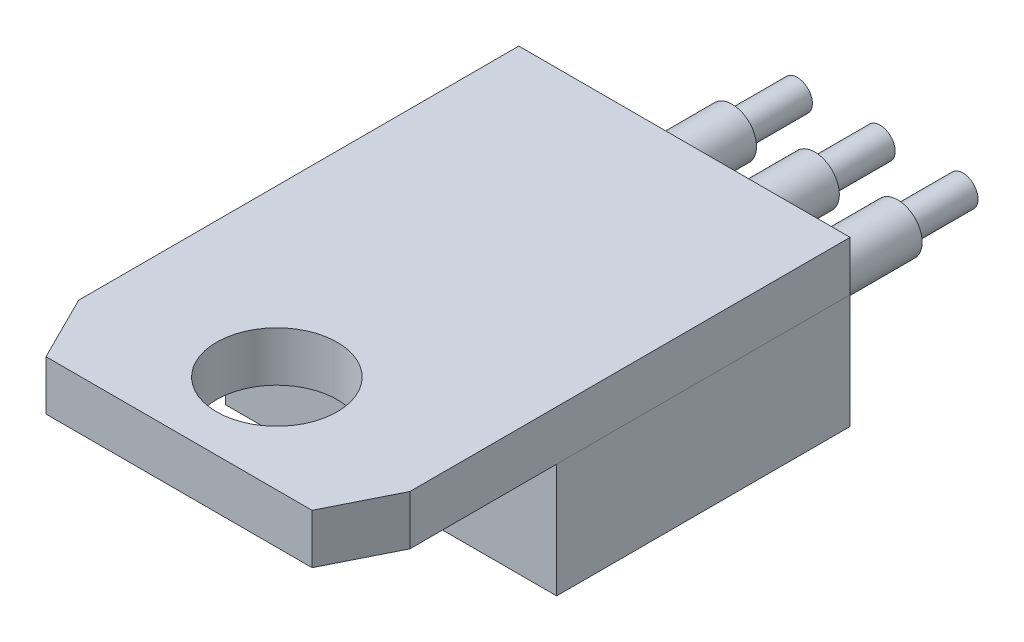
ISO-10303-21;
HEADER;
FILE_DESCRIPTION(('STEP AP214'),'2;1');
FILE_NAME('part.step','',(''),(''),'','','');
FILE_SCHEMA(('AUTOMOTIVE_DESIGN { 1 0 10303 214 1 1 1 1 }'));
ENDSEC;
DATA;
#1=APPLICATION_CONTEXT('core data for automotive mechanical design processes');
#2=APPLICATION_PROTOCOL_DEFINITION('international standard','automotive_design',2000,#1);
#3=PRODUCT_CONTEXT('',#1,'mechanical');
#4=PRODUCT('Part','Part','',(#3));
#5=PRODUCT_RELATED_PRODUCT_CATEGORY('part','',(#4));
#6=PRODUCT_DEFINITION_FORMATION('','',#4);
#7=PRODUCT_DEFINITION_CONTEXT('part definition',#1,'design');
#8=PRODUCT_DEFINITION('design','',#6,#7);
#9=PRODUCT_DEFINITION_SHAPE('','',#8);
#10=(LENGTH_UNIT() NAMED_UNIT(*) SI_UNIT(.MILLI.,.METRE.));
#11=(NAMED_UNIT(*) PLANE_ANGLE_UNIT() SI_UNIT($,.RADIAN.));
#12=(NAMED_UNIT(*) SI_UNIT($,.STERADIAN.) SOLID_ANGLE_UNIT());
#13=UNCERTAINTY_MEASURE_WITH_UNIT(LENGTH_MEASURE(1.E-05),#10,'distance_accuracy_value','');
#14=(GEOMETRIC_REPRESENTATION_CONTEXT(3) GLOBAL_UNCERTAINTY_ASSIGNED_CONTEXT((#13)) GLOBAL_UNIT_ASSIGNED_CONTEXT((#10,
#11,#12)) REPRESENTATION_CONTEXT('',''));
#15=CARTESIAN_POINT('',(0.,0.,0.));
#16=DIRECTION('',(0.,0.,1.));
#17=DIRECTION('',(1.,0.,0.));
#18=AXIS2_PLACEMENT_3D('',#15,#16,#17);
#19=CARTESIAN_POINT('',(5.0800000000002,167.114407598193,0.));
#20=DIRECTION('',(1.,0.,0.));
#21=DIRECTION('',(0.,0.,-1.));
#22=AXIS2_PLACEMENT_3D('',#19,#20,#21);
#23=PLANE('',#22);
#24=DIRECTION('',(0.,0.,1.));
#25=VECTOR('',#24,1.);
#26=CARTESIAN_POINT('',(5.0800000000002,165.590407598193,0.));
#27=LINE('',#26,#25);
#28=CARTESIAN_POINT('',(5.0800000000002,165.590407598193,9.));
#29=VERTEX_POINT('',#28);
#30=CARTESIAN_POINT('',(5.0800000000002,165.590407598193,13.5000000000001));
#31=VERTEX_POINT('',#30);
#32=EDGE_CURVE('E176',#29,#31,#27,.T.);
#33=ORIENTED_EDGE('',*,*,#32,.F.);
#34=DIRECTION('',(0.,0.,-1.));
#35=VECTOR('',#34,1.);
#36=CARTESIAN_POINT('',(5.0800000000002,165.590407598193,0.));
#37=LINE('',#36,#35);
#38=CARTESIAN_POINT('',(5.0800000000002,165.590407598193,0.));
#39=VERTEX_POINT('',#38);
#40=EDGE_CURVE('E11',#29,#39,#37,.T.);
#41=ORIENTED_EDGE('',*,*,#40,.T.);
#42=DIRECTION('',(0.,-1.,0.));
#43=VECTOR('',#42,1.);
#44=CARTESIAN_POINT('',(5.0800000000002,167.114407598193,0.));
#45=LINE('',#44,#43);
#46=CARTESIAN_POINT('',(5.0800000000002,167.114407598193,0.));
#47=VERTEX_POINT('',#46);
#48=EDGE_CURVE('E203',#47,#39,#45,.T.);
#49=ORIENTED_EDGE('',*,*,#48,.F.);
#50=DIRECTION('',(0.,0.,1.));
#51=VECTOR('',#50,1.);
#52=CARTESIAN_POINT('',(5.0800000000002,167.114407598193,0.));
#53=LINE('',#52,#51);
#54=CARTESIAN_POINT('',(5.0800000000002,167.114407598193,13.5000000000001));
#55=VERTEX_POINT('',#54);
#56=EDGE_CURVE('E214',#47,#55,#53,.T.);
#57=ORIENTED_EDGE('',*,*,#56,.T.);
#58=DIRECTION('',(0.,-1.,0.));
#59=VECTOR('',#58,1.);
#60=CARTESIAN_POINT('',(5.0800000000002,167.114407598193,13.5000000000001));
#61=LINE('',#60,#59);
#62=EDGE_CURVE('E200',#55,#31,#61,.T.);
#63=ORIENTED_EDGE('',*,*,#62,.T.);
#64=EDGE_LOOP('',(#33,#41,#49,#57,#63));
#65=FACE_BOUND('',#64,.T.);
#66=ADVANCED_FACE('F37',(#65),#23,.T.);
#67=CARTESIAN_POINT('',(-5.08000000000019,167.114407598193,0.));
#68=DIRECTION('',(0.,0.,-1.));
#69=DIRECTION('',(-1.,0.,0.));
#70=AXIS2_PLACEMENT_3D('',#67,#68,#69);
#71=PLANE('',#70);
#72=ORIENTED_EDGE('',*,*,#48,.T.);
#73=DIRECTION('',(-1.,0.,0.));
#74=VECTOR('',#73,1.);
#75=CARTESIAN_POINT('',(-5.08000000000019,165.590407598193,0.));
#76=LINE('',#75,#74);
#77=CARTESIAN_POINT('',(-5.08000000000019,165.590407598193,0.));
#78=VERTEX_POINT('',#77);
#79=EDGE_CURVE('E47',#39,#78,#76,.T.);
#80=ORIENTED_EDGE('',*,*,#79,.T.);
#81=DIRECTION('',(0.,-1.,0.));
#82=VECTOR('',#81,1.);
#83=CARTESIAN_POINT('',(-5.08000000000019,167.114407598193,0.));
#84=LINE('',#83,#82);
#85=CARTESIAN_POINT('',(-5.08000000000019,167.114407598193,0.));
#86=VERTEX_POINT('',#85);
#87=EDGE_CURVE('E167',#86,#78,#84,.T.);
#88=ORIENTED_EDGE('',*,*,#87,.F.);
#89=DIRECTION('',(1.,0.,0.));
#90=VECTOR('',#89,1.);
#91=CARTESIAN_POINT('',(-5.08000000000019,167.114407598193,0.));
#92=LINE('',#91,#90);
#93=EDGE_CURVE('E219',#86,#47,#92,.T.);
#94=ORIENTED_EDGE('',*,*,#93,.T.);
#95=EDGE_LOOP('',(#72,#80,#88,#94));
#96=FACE_BOUND('',#95,.T.);
#97=ADVANCED_FACE('F244',(#96),#71,.T.);
#98=CARTESIAN_POINT('',(-5.0800000000002,167.114407598193,13.5000000000001));
#99=DIRECTION('',(-1.,0.,0.));
#100=DIRECTION('',(0.,0.,1.));
#101=AXIS2_PLACEMENT_3D('',#98,#99,#100);
#102=PLANE('',#101);
#103=ORIENTED_EDGE('',*,*,#87,.T.);
#104=DIRECTION('',(0.,0.,1.));
#105=VECTOR('',#104,1.);
#106=CARTESIAN_POINT('',(-5.0800000000002,165.590407598193,13.5000000000001));
#107=LINE('',#106,#105);
#108=CARTESIAN_POINT('',(-5.0800000000002,165.590407598193,9.00000000000001));
#109=VERTEX_POINT('',#108);
#110=EDGE_CURVE('E147',#78,#109,#107,.T.);
#111=ORIENTED_EDGE('',*,*,#110,.T.);
#112=DIRECTION('',(0.,0.,-1.));
#113=VECTOR('',#112,1.);
#114=CARTESIAN_POINT('',(-5.0800000000002,165.590407598193,13.5000000000001));
#115=LINE('',#114,#113);
#116=CARTESIAN_POINT('',(-5.0800000000002,165.590407598193,13.5000000000001));
#117=VERTEX_POINT('',#116);
#118=EDGE_CURVE('E164',#117,#109,#115,.T.);
#119=ORIENTED_EDGE('',*,*,#118,.F.);
#120=DIRECTION('',(0.,-1.,0.));
#121=VECTOR('',#120,1.);
#122=CARTESIAN_POINT('',(-5.0800000000002,167.114407598193,13.5000000000001));
#123=LINE('',#122,#121);
#124=CARTESIAN_POINT('',(-5.0800000000002,167.114407598193,13.5000000000001));
#125=VERTEX_POINT('',#124);
#126=EDGE_CURVE('E207',#125,#117,#123,.T.);
#127=ORIENTED_EDGE('',*,*,#126,.F.);
#128=DIRECTION('',(0.,0.,-1.));
#129=VECTOR('',#128,1.);
#130=CARTESIAN_POINT('',(-5.0800000000002,167.114407598193,13.5000000000001));
#131=LINE('',#130,#129);
#132=EDGE_CURVE('E271',#125,#86,#131,.T.);
#133=ORIENTED_EDGE('',*,*,#132,.T.);
#134=EDGE_LOOP('',(#103,#111,#119,#127,#133));
#135=FACE_BOUND('',#134,.T.);
#136=ADVANCED_FACE('F163',(#135),#102,.T.);
#137=CARTESIAN_POINT('',(4.08000000000031,167.114407598193,15.5000000000001));
#138=DIRECTION('',(0.,0.,1.));
#139=DIRECTION('',(1.,0.,0.));
#140=AXIS2_PLACEMENT_3D('',#137,#138,#139);
#141=PLANE('',#140);
#142=DIRECTION('',(-1.,0.,0.));
#143=VECTOR('',#142,1.);
#144=CARTESIAN_POINT('',(4.08000000000031,165.590407598193,15.5000000000001));
#145=LINE('',#144,#143);
#146=CARTESIAN_POINT('',(4.08000000000031,165.590407598193,15.5000000000001));
#147=VERTEX_POINT('',#146);
#148=CARTESIAN_POINT('',(-4.08000000000031,165.590407598193,15.5000000000001));
#149=VERTEX_POINT('',#148);
#150=EDGE_CURVE('E223',#147,#149,#145,.T.);
#151=ORIENTED_EDGE('',*,*,#150,.F.);
#152=DIRECTION('',(0.,-1.,0.));
#153=VECTOR('',#152,1.);
#154=CARTESIAN_POINT('',(4.08000000000031,167.114407598193,15.5000000000001));
#155=LINE('',#154,#153);
#156=CARTESIAN_POINT('',(4.08000000000031,167.114407598193,15.5000000000001));
#157=VERTEX_POINT('',#156);
#158=EDGE_CURVE('E148',#157,#147,#155,.T.);
#159=ORIENTED_EDGE('',*,*,#158,.F.);
#160=DIRECTION('',(-1.,0.,0.));
#161=VECTOR('',#160,1.);
#162=CARTESIAN_POINT('',(4.08000000000031,167.114407598193,15.5000000000001));
#163=LINE('',#162,#161);
#164=CARTESIAN_POINT('',(-4.08000000000031,167.114407598193,15.5000000000001));
#165=VERTEX_POINT('',#164);
#166=EDGE_CURVE('E198',#157,#165,#163,.T.);
#167=ORIENTED_EDGE('',*,*,#166,.T.);
#168=DIRECTION('',(0.,-1.,0.));
#169=VECTOR('',#168,1.);
#170=CARTESIAN_POINT('',(-4.08000000000031,167.114407598193,15.5000000000001));
#171=LINE('',#170,#169);
#172=EDGE_CURVE('E208',#165,#149,#171,.T.);
#173=ORIENTED_EDGE('',*,*,#172,.T.);
#174=EDGE_LOOP('',(#151,#159,#167,#173));
#175=FACE_BOUND('',#174,.T.);
#176=ADVANCED_FACE('F39',(#175),#141,.T.);
#177=CARTESIAN_POINT('',(5.0800000000002,167.114407598193,13.5000000000001));
#178=DIRECTION('',(0.894427190999936,0.,0.447213595499918));
#179=DIRECTION('',(0.447213595499918,0.,-0.894427190999936));
#180=AXIS2_PLACEMENT_3D('',#177,#178,#179);
#181=PLANE('',#180);
#182=DIRECTION('',(-0.447213595499918,0.,0.894427190999936));
#183=VECTOR('',#182,1.);
#184=CARTESIAN_POINT('',(5.0800000000002,165.590407598193,13.5000000000001));
#185=LINE('',#184,#183);
#186=EDGE_CURVE('E189',#31,#147,#185,.T.);
#187=ORIENTED_EDGE('',*,*,#186,.F.);
#188=ORIENTED_EDGE('',*,*,#62,.F.);
#189=DIRECTION('',(-0.447213595499918,0.,0.894427190999936));
#190=VECTOR('',#189,1.);
#191=CARTESIAN_POINT('',(5.0800000000002,167.114407598193,13.5000000000001));
#192=LINE('',#191,#190);
#193=EDGE_CURVE('E209',#55,#157,#192,.T.);
#194=ORIENTED_EDGE('',*,*,#193,.T.);
#195=ORIENTED_EDGE('',*,*,#158,.T.);
#196=EDGE_LOOP('',(#187,#188,#194,#195));
#197=FACE_BOUND('',#196,.T.);
#198=ADVANCED_FACE('F252',(#197),#181,.T.);
#199=ORIENTED_EDGE('',*,*,#40,.F.);
#200=DIRECTION('',(0.,1.,0.));
#201=VECTOR('',#200,1.);
#202=CARTESIAN_POINT('',(5.0800000000002,162.090407598193,9.00000000000001));
#203=LINE('',#202,#201);
#204=CARTESIAN_POINT('',(5.0800000000002,162.090407598193,9.00000000000001));
#205=VERTEX_POINT('',#204);
#206=EDGE_CURVE('E113',#205,#29,#203,.T.);
#207=ORIENTED_EDGE('',*,*,#206,.F.);
#208=DIRECTION('',(0.,0.,1.));
#209=VECTOR('',#208,1.);
#210=CARTESIAN_POINT('',(5.0800000000002,162.090407598193,0.));
#211=LINE('',#210,#209);
#212=CARTESIAN_POINT('',(5.0800000000002,162.090407598193,0.));
#213=VERTEX_POINT('',#212);
#214=EDGE_CURVE('E120',#213,#205,#211,.T.);
#215=ORIENTED_EDGE('',*,*,#214,.F.);
#216=EDGE_CURVE('E205',#39,#213,#45,.T.);
#217=ORIENTED_EDGE('',*,*,#216,.F.);
#218=EDGE_LOOP('',(#199,#207,#215,#217));
#219=FACE_BOUND('',#218,.T.);
#220=ADVANCED_FACE('F131',(#219),#23,.T.);
#221=ORIENTED_EDGE('',*,*,#79,.F.);
#222=ORIENTED_EDGE('',*,*,#216,.T.);
#223=DIRECTION('',(1.,0.,0.));
#224=VECTOR('',#223,1.);
#225=CARTESIAN_POINT('',(-5.08000000000019,162.090407598193,0.));
#226=LINE('',#225,#224);
#227=CARTESIAN_POINT('',(-5.08000000000019,162.090407598193,0.));
#228=VERTEX_POINT('',#227);
#229=EDGE_CURVE('E126',#228,#213,#226,.T.);
#230=ORIENTED_EDGE('',*,*,#229,.F.);
#231=EDGE_CURVE('E181',#78,#228,#84,.T.);
#232=ORIENTED_EDGE('',*,*,#231,.F.);
#233=EDGE_LOOP('',(#221,#222,#230,#232));
#234=FACE_BOUND('',#233,.T.);
#235=CARTESIAN_POINT('',(2.53999999999998,164.090407598193,0.));
#236=DIRECTION('',(0.,0.,-1.));
#237=DIRECTION('',(-1.,0.,0.));
#238=AXIS2_PLACEMENT_3D('',#235,#236,#237);
#239=CIRCLE('',#238,0.750000000000033);
#240=CARTESIAN_POINT('',(1.78999999999995,164.090407598193,0.));
#241=VERTEX_POINT('',#240);
#242=EDGE_CURVE('E520',#241,#241,#239,.T.);
#243=ORIENTED_EDGE('',*,*,#242,.F.);
#244=EDGE_LOOP('',(#243));
#245=FACE_BOUND('',#244,.T.);
#246=CARTESIAN_POINT('',(0.,164.090407598193,0.));
#247=DIRECTION('',(0.,0.,-1.));
#248=DIRECTION('',(-1.,0.,0.));
#249=AXIS2_PLACEMENT_3D('',#246,#247,#248);
#250=CIRCLE('',#249,0.750000000000033);
#251=CARTESIAN_POINT('',(-0.750000000000033,164.090407598193,0.));
#252=VERTEX_POINT('',#251);
#253=EDGE_CURVE('E524',#252,#252,#250,.T.);
#254=ORIENTED_EDGE('',*,*,#253,.F.);
#255=EDGE_LOOP('',(#254));
#256=FACE_BOUND('',#255,.T.);
#257=CARTESIAN_POINT('',(-2.53999999999998,164.090407598193,0.));
#258=DIRECTION('',(0.,0.,-1.));
#259=DIRECTION('',(1.,0.,0.));
#260=AXIS2_PLACEMENT_3D('',#257,#258,#259);
#261=CIRCLE('',#260,0.750000000000033);
#262=CARTESIAN_POINT('',(-1.78999999999995,164.090407598193,0.));
#263=VERTEX_POINT('',#262);
#264=EDGE_CURVE('E530',#263,#263,#261,.T.);
#265=ORIENTED_EDGE('',*,*,#264,.F.);
#266=EDGE_LOOP('',(#265));
#267=FACE_BOUND('',#266,.T.);
#268=ADVANCED_FACE('F250',(#234,#245,#256,#267),#71,.T.);
#269=ORIENTED_EDGE('',*,*,#110,.F.);
#270=ORIENTED_EDGE('',*,*,#231,.T.);
#271=DIRECTION('',(0.,0.,-1.));
#272=VECTOR('',#271,1.);
#273=CARTESIAN_POINT('',(-5.0800000000002,162.090407598193,9.00000000000001));
#274=LINE('',#273,#272);
#275=CARTESIAN_POINT('',(-5.0800000000002,162.090407598193,9.00000000000001));
#276=VERTEX_POINT('',#275);
#277=EDGE_CURVE('E119',#276,#228,#274,.T.);
#278=ORIENTED_EDGE('',*,*,#277,.F.);
#279=DIRECTION('',(0.,1.,0.));
#280=VECTOR('',#279,1.);
#281=CARTESIAN_POINT('',(-5.0800000000002,162.090407598193,9.00000000000001));
#282=LINE('',#281,#280);
#283=EDGE_CURVE('E115',#276,#109,#282,.T.);
#284=ORIENTED_EDGE('',*,*,#283,.T.);
#285=EDGE_LOOP('',(#269,#270,#278,#284));
#286=FACE_BOUND('',#285,.T.);
#287=ADVANCED_FACE('F180',(#286),#102,.T.);
#288=CARTESIAN_POINT('',(-4.08000000000031,167.114407598193,15.5000000000001));
#289=DIRECTION('',(-0.894427190999936,0.,0.447213595499918));
#290=DIRECTION('',(0.447213595499918,0.,0.894427190999936));
#291=AXIS2_PLACEMENT_3D('',#288,#289,#290);
#292=PLANE('',#291);
#293=DIRECTION('',(-0.447213595499918,0.,-0.894427190999936));
#294=VECTOR('',#293,1.);
#295=CARTESIAN_POINT('',(-4.08000000000031,165.590407598193,15.5000000000001));
#296=LINE('',#295,#294);
#297=EDGE_CURVE('E175',#149,#117,#296,.T.);
#298=ORIENTED_EDGE('',*,*,#297,.F.);
#299=ORIENTED_EDGE('',*,*,#172,.F.);
#300=DIRECTION('',(-0.447213595499918,0.,-0.894427190999936));
#301=VECTOR('',#300,1.);
#302=CARTESIAN_POINT('',(-4.08000000000031,167.114407598193,15.5000000000001));
#303=LINE('',#302,#301);
#304=EDGE_CURVE('E269',#165,#125,#303,.T.);
#305=ORIENTED_EDGE('',*,*,#304,.T.);
#306=ORIENTED_EDGE('',*,*,#126,.T.);
#307=EDGE_LOOP('',(#298,#299,#305,#306));
#308=FACE_BOUND('',#307,.T.);
#309=ADVANCED_FACE('F240',(#308),#292,.T.);
#310=CARTESIAN_POINT('',(0.,167.114407598193,0.));
#311=DIRECTION('',(0.,-1.,0.));
#312=DIRECTION('',(0.,0.,-1.));
#313=AXIS2_PLACEMENT_3D('',#310,#311,#312);
#314=PLANE('',#313);
#315=CARTESIAN_POINT('',(0.,167.114407598193,12.499999999999));
#316=DIRECTION('',(0.,-1.,0.));
#317=DIRECTION('',(0.,0.,1.));
#318=AXIS2_PLACEMENT_3D('',#315,#316,#317);
#319=CIRCLE('',#318,1.85000000000002);
#320=CARTESIAN_POINT('',(0.,167.114407598193,14.349999999999));
#321=VERTEX_POINT('',#320);
#322=EDGE_CURVE('E136',#321,#321,#319,.T.);
#323=ORIENTED_EDGE('',*,*,#322,.T.);
#324=EDGE_LOOP('',(#323));
#325=FACE_BOUND('',#324,.T.);
#326=ORIENTED_EDGE('',*,*,#166,.F.);
#327=ORIENTED_EDGE('',*,*,#193,.F.);
#328=ORIENTED_EDGE('',*,*,#56,.F.);
#329=ORIENTED_EDGE('',*,*,#93,.F.);
#330=ORIENTED_EDGE('',*,*,#132,.F.);
#331=ORIENTED_EDGE('',*,*,#304,.F.);
#332=EDGE_LOOP('',(#326,#327,#328,#329,#330,#331));
#333=FACE_BOUND('',#332,.T.);
#334=ADVANCED_FACE('F227',(#325,#333),#314,.F.);
#335=CARTESIAN_POINT('',(0.,165.590407598193,0.));
#336=DIRECTION('',(0.,-1.,0.));
#337=DIRECTION('',(0.,0.,-1.));
#338=AXIS2_PLACEMENT_3D('',#335,#336,#337);
#339=PLANE('',#338);
#340=DIRECTION('',(-1.,0.,0.));
#341=VECTOR('',#340,1.);
#342=CARTESIAN_POINT('',(5.0800000000002,165.590407598193,9.00000000000001));
#343=LINE('',#342,#341);
#344=EDGE_CURVE('E129',#29,#109,#343,.T.);
#345=ORIENTED_EDGE('',*,*,#344,.F.);
#346=ORIENTED_EDGE('',*,*,#32,.T.);
#347=ORIENTED_EDGE('',*,*,#186,.T.);
#348=ORIENTED_EDGE('',*,*,#150,.T.);
#349=ORIENTED_EDGE('',*,*,#297,.T.);
#350=ORIENTED_EDGE('',*,*,#118,.T.);
#351=EDGE_LOOP('',(#345,#346,#347,#348,#349,#350));
#352=FACE_BOUND('',#351,.T.);
#353=CARTESIAN_POINT('',(0.,165.590407598193,12.499999999999));
#354=DIRECTION('',(0.,-1.,0.));
#355=DIRECTION('',(0.,0.,1.));
#356=AXIS2_PLACEMENT_3D('',#353,#354,#355);
#357=CIRCLE('',#356,1.85000000000002);
#358=CARTESIAN_POINT('',(0.,165.590407598193,14.349999999999));
#359=VERTEX_POINT('',#358);
#360=EDGE_CURVE('E133',#359,#359,#357,.T.);
#361=ORIENTED_EDGE('',*,*,#360,.F.);
#362=EDGE_LOOP('',(#361));
#363=FACE_BOUND('',#362,.T.);
#364=ADVANCED_FACE('F171',(#352,#363),#339,.T.);
#365=CARTESIAN_POINT('',(0.,167.114407598193,12.499999999999));
#366=DIRECTION('',(0.,-1.,0.));
#367=DIRECTION('',(0.,0.,-1.));
#368=AXIS2_PLACEMENT_3D('',#365,#366,#367);
#369=CYLINDRICAL_SURFACE('',#368,1.85000000000002);
#370=ORIENTED_EDGE('',*,*,#322,.F.);
#371=EDGE_LOOP('',(#370));
#372=FACE_BOUND('',#371,.T.);
#373=ORIENTED_EDGE('',*,*,#360,.T.);
#374=EDGE_LOOP('',(#373));
#375=FACE_BOUND('',#374,.T.);
#376=ADVANCED_FACE('F230',(#372,#375),#369,.F.);
#377=CARTESIAN_POINT('',(5.0800000000002,162.090407598193,9.00000000000001));
#378=DIRECTION('',(0.,0.,-1.));
#379=DIRECTION('',(-1.,0.,0.));
#380=AXIS2_PLACEMENT_3D('',#377,#378,#379);
#381=PLANE('',#380);
#382=ORIENTED_EDGE('',*,*,#344,.T.);
#383=ORIENTED_EDGE('',*,*,#283,.F.);
#384=DIRECTION('',(-1.,0.,0.));
#385=VECTOR('',#384,1.);
#386=CARTESIAN_POINT('',(5.0800000000002,162.090407598193,9.00000000000001));
#387=LINE('',#386,#385);
#388=EDGE_CURVE('E108',#205,#276,#387,.T.);
#389=ORIENTED_EDGE('',*,*,#388,.F.);
#390=ORIENTED_EDGE('',*,*,#206,.T.);
#391=EDGE_LOOP('',(#382,#383,#389,#390));
#392=FACE_BOUND('',#391,.T.);
#393=ADVANCED_FACE('F111',(#392),#381,.F.);
#394=CARTESIAN_POINT('',(0.,162.090407598193,0.));
#395=DIRECTION('',(0.,-1.,0.));
#396=DIRECTION('',(0.,0.,-1.));
#397=AXIS2_PLACEMENT_3D('',#394,#395,#396);
#398=PLANE('',#397);
#399=ORIENTED_EDGE('',*,*,#214,.T.);
#400=ORIENTED_EDGE('',*,*,#388,.T.);
#401=ORIENTED_EDGE('',*,*,#277,.T.);
#402=ORIENTED_EDGE('',*,*,#229,.T.);
#403=EDGE_LOOP('',(#399,#400,#401,#402));
#404=FACE_BOUND('',#403,.T.);
#405=ADVANCED_FACE('F124',(#404),#398,.T.);
#406=CARTESIAN_POINT('',(-2.53999999999998,164.090407598193,-4.));
#407=DIRECTION('',(0.,0.,1.));
#408=DIRECTION('',(1.,0.,0.));
#409=AXIS2_PLACEMENT_3D('',#406,#407,#408);
#410=CYLINDRICAL_SURFACE('',#409,0.750000000000033);
#411=CARTESIAN_POINT('',(-2.53999999999998,164.090407598193,-4.));
#412=DIRECTION('',(0.,0.,-1.));
#413=DIRECTION('',(1.,0.,0.));
#414=AXIS2_PLACEMENT_3D('',#411,#412,#413);
#415=CIRCLE('',#414,0.750000000000033);
#416=CARTESIAN_POINT('',(-1.78999999999995,164.090407598193,-4.));
#417=VERTEX_POINT('',#416);
#418=EDGE_CURVE('E178',#417,#417,#415,.T.);
#419=ORIENTED_EDGE('',*,*,#418,.F.);
#420=EDGE_LOOP('',(#419));
#421=FACE_BOUND('',#420,.T.);
#422=ORIENTED_EDGE('',*,*,#264,.T.);
#423=EDGE_LOOP('',(#422));
#424=FACE_BOUND('',#423,.T.);
#425=ADVANCED_FACE('F333',(#421,#424),#410,.T.);
#426=CARTESIAN_POINT('',(-2.53999999999998,164.090407598193,-4.));
#427=DIRECTION('',(0.,0.,1.));
#428=DIRECTION('',(1.,0.,0.));
#429=AXIS2_PLACEMENT_3D('',#426,#427,#428);
#430=PLANE('',#429);
#431=CARTESIAN_POINT('',(-2.53999999999998,164.090407598193,-4.));
#432=DIRECTION('',(0.,0.,1.));
#433=DIRECTION('',(1.,0.,0.));
#434=AXIS2_PLACEMENT_3D('',#431,#432,#433);
#435=CIRCLE('',#434,0.463550000000042);
#436=CARTESIAN_POINT('',(-2.07644999999994,164.090407598193,-4.));
#437=VERTEX_POINT('',#436);
#438=EDGE_CURVE('E144',#437,#437,#435,.F.);
#439=ORIENTED_EDGE('',*,*,#438,.F.);
#440=EDGE_LOOP('',(#439));
#441=FACE_BOUND('',#440,.T.);
#442=ORIENTED_EDGE('',*,*,#418,.T.);
#443=EDGE_LOOP('',(#442));
#444=FACE_BOUND('',#443,.T.);
#445=ADVANCED_FACE('F342',(#441,#444),#430,.F.);
#446=CARTESIAN_POINT('',(0.,164.090407598193,-4.));
#447=DIRECTION('',(0.,0.,1.));
#448=DIRECTION('',(1.,0.,0.));
#449=AXIS2_PLACEMENT_3D('',#446,#447,#448);
#450=CYLINDRICAL_SURFACE('',#449,0.750000000000033);
#451=CARTESIAN_POINT('',(0.,164.090407598193,-4.));
#452=DIRECTION('',(0.,0.,-1.));
#453=DIRECTION('',(-1.,0.,0.));
#454=AXIS2_PLACEMENT_3D('',#451,#452,#453);
#455=CIRCLE('',#454,0.750000000000033);
#456=CARTESIAN_POINT('',(-0.750000000000032,164.090407598193,-4.));
#457=VERTEX_POINT('',#456);
#458=EDGE_CURVE('E527',#457,#457,#455,.T.);
#459=ORIENTED_EDGE('',*,*,#458,.F.);
#460=EDGE_LOOP('',(#459));
#461=FACE_BOUND('',#460,.T.);
#462=ORIENTED_EDGE('',*,*,#253,.T.);
#463=EDGE_LOOP('',(#462));
#464=FACE_BOUND('',#463,.T.);
#465=ADVANCED_FACE('F350',(#461,#464),#450,.T.);
#466=CARTESIAN_POINT('',(0.,164.090407598193,-4.));
#467=DIRECTION('',(0.,0.,-1.));
#468=DIRECTION('',(-1.,0.,0.));
#469=AXIS2_PLACEMENT_3D('',#466,#467,#468);
#470=PLANE('',#469);
#471=CARTESIAN_POINT('',(0.,164.090407598193,-4.));
#472=DIRECTION('',(0.,0.,-1.));
#473=DIRECTION('',(-1.,0.,0.));
#474=AXIS2_PLACEMENT_3D('',#471,#472,#473);
#475=CIRCLE('',#474,0.463550000000042);
#476=CARTESIAN_POINT('',(-0.463550000000042,164.090407598193,-4.));
#477=VERTEX_POINT('',#476);
#478=EDGE_CURVE('E506',#477,#477,#475,.T.);
#479=ORIENTED_EDGE('',*,*,#478,.F.);
#480=EDGE_LOOP('',(#479));
#481=FACE_BOUND('',#480,.T.);
#482=ORIENTED_EDGE('',*,*,#458,.T.);
#483=EDGE_LOOP('',(#482));
#484=FACE_BOUND('',#483,.T.);
#485=ADVANCED_FACE('F355',(#481,#484),#470,.T.);
#486=CARTESIAN_POINT('',(2.53999999999998,164.090407598193,-4.));
#487=DIRECTION('',(0.,0.,1.));
#488=DIRECTION('',(1.,0.,0.));
#489=AXIS2_PLACEMENT_3D('',#486,#487,#488);
#490=CYLINDRICAL_SURFACE('',#489,0.750000000000033);
#491=CARTESIAN_POINT('',(2.53999999999998,164.090407598193,-4.));
#492=DIRECTION('',(0.,0.,-1.));
#493=DIRECTION('',(-1.,0.,0.));
#494=AXIS2_PLACEMENT_3D('',#491,#492,#493);
#495=CIRCLE('',#494,0.750000000000033);
#496=CARTESIAN_POINT('',(1.78999999999995,164.090407598193,-4.));
#497=VERTEX_POINT('',#496);
#498=EDGE_CURVE('E521',#497,#497,#495,.T.);
#499=ORIENTED_EDGE('',*,*,#498,.F.);
#500=EDGE_LOOP('',(#499));
#501=FACE_BOUND('',#500,.T.);
#502=ORIENTED_EDGE('',*,*,#242,.T.);
#503=EDGE_LOOP('',(#502));
#504=FACE_BOUND('',#503,.T.);
#505=ADVANCED_FACE('F363',(#501,#504),#490,.T.);
#506=CARTESIAN_POINT('',(2.53999999999998,164.090407598193,-4.));
#507=DIRECTION('',(0.,0.,-1.));
#508=DIRECTION('',(-1.,0.,0.));
#509=AXIS2_PLACEMENT_3D('',#506,#507,#508);
#510=PLANE('',#509);
#511=CARTESIAN_POINT('',(2.53999999999998,164.090407598193,-4.));
#512=DIRECTION('',(0.,0.,-1.));
#513=DIRECTION('',(-1.,0.,0.));
#514=AXIS2_PLACEMENT_3D('',#511,#512,#513);
#515=CIRCLE('',#514,0.463550000000042);
#516=CARTESIAN_POINT('',(2.07644999999994,164.090407598193,-4.));
#517=VERTEX_POINT('',#516);
#518=EDGE_CURVE('E507',#517,#517,#515,.T.);
#519=ORIENTED_EDGE('',*,*,#518,.F.);
#520=EDGE_LOOP('',(#519));
#521=FACE_BOUND('',#520,.T.);
#522=ORIENTED_EDGE('',*,*,#498,.T.);
#523=EDGE_LOOP('',(#522));
#524=FACE_BOUND('',#523,.T.);
#525=ADVANCED_FACE('F368',(#521,#524),#510,.T.);
#526=CARTESIAN_POINT('',(-2.53999999999998,164.090407598193,-6.));
#527=DIRECTION('',(0.,0.,1.));
#528=DIRECTION('',(1.,0.,0.));
#529=AXIS2_PLACEMENT_3D('',#526,#527,#528);
#530=CYLINDRICAL_SURFACE('',#529,0.463550000000042);
#531=CARTESIAN_POINT('',(-2.53999999999998,164.090407598193,-6.));
#532=DIRECTION('',(0.,0.,-1.));
#533=DIRECTION('',(1.,0.,0.));
#534=AXIS2_PLACEMENT_3D('',#531,#532,#533);
#535=CIRCLE('',#534,0.463550000000042);
#536=CARTESIAN_POINT('',(-2.07644999999994,164.090407598193,-6.));
#537=VERTEX_POINT('',#536);
#538=EDGE_CURVE('E516',#537,#537,#535,.T.);
#539=ORIENTED_EDGE('',*,*,#538,.F.);
#540=EDGE_LOOP('',(#539));
#541=FACE_BOUND('',#540,.T.);
#542=ORIENTED_EDGE('',*,*,#438,.T.);
#543=EDGE_LOOP('',(#542));
#544=FACE_BOUND('',#543,.T.);
#545=ADVANCED_FACE('F392',(#541,#544),#530,.T.);
#546=CARTESIAN_POINT('',(-2.53999999999998,164.090407598193,-6.));
#547=DIRECTION('',(0.,0.,1.));
#548=DIRECTION('',(1.,0.,0.));
#549=AXIS2_PLACEMENT_3D('',#546,#547,#548);
#550=PLANE('',#549);
#551=ORIENTED_EDGE('',*,*,#538,.T.);
#552=EDGE_LOOP('',(#551));
#553=FACE_BOUND('',#552,.T.);
#554=ADVANCED_FACE('F402',(#553),#550,.F.);
#555=CARTESIAN_POINT('',(0.,164.090407598193,-6.));
#556=DIRECTION('',(0.,0.,1.));
#557=DIRECTION('',(1.,0.,0.));
#558=AXIS2_PLACEMENT_3D('',#555,#556,#557);
#559=CYLINDRICAL_SURFACE('',#558,0.463550000000042);
#560=CARTESIAN_POINT('',(0.,164.090407598193,-6.));
#561=DIRECTION('',(0.,0.,-1.));
#562=DIRECTION('',(-1.,0.,0.));
#563=AXIS2_PLACEMENT_3D('',#560,#561,#562);
#564=CIRCLE('',#563,0.463550000000042);
#565=CARTESIAN_POINT('',(-0.463550000000042,164.090407598193,-6.));
#566=VERTEX_POINT('',#565);
#567=EDGE_CURVE('E510',#566,#566,#564,.T.);
#568=ORIENTED_EDGE('',*,*,#567,.F.);
#569=EDGE_LOOP('',(#568));
#570=FACE_BOUND('',#569,.T.);
#571=ORIENTED_EDGE('',*,*,#478,.T.);
#572=EDGE_LOOP('',(#571));
#573=FACE_BOUND('',#572,.T.);
#574=ADVANCED_FACE('F412',(#570,#573),#559,.T.);
#575=CARTESIAN_POINT('',(0.,164.090407598193,-6.));
#576=DIRECTION('',(0.,0.,-1.));
#577=DIRECTION('',(-1.,0.,0.));
#578=AXIS2_PLACEMENT_3D('',#575,#576,#577);
#579=PLANE('',#578);
#580=ORIENTED_EDGE('',*,*,#567,.T.);
#581=EDGE_LOOP('',(#580));
#582=FACE_BOUND('',#581,.T.);
#583=ADVANCED_FACE('F422',(#582),#579,.T.);
#584=CARTESIAN_POINT('',(2.53999999999998,164.090407598193,-6.));
#585=DIRECTION('',(0.,0.,1.));
#586=DIRECTION('',(1.,0.,0.));
#587=AXIS2_PLACEMENT_3D('',#584,#585,#586);
#588=CYLINDRICAL_SURFACE('',#587,0.463550000000042);
#589=CARTESIAN_POINT('',(2.53999999999998,164.090407598193,-6.));
#590=DIRECTION('',(0.,0.,-1.));
#591=DIRECTION('',(-1.,0.,0.));
#592=AXIS2_PLACEMENT_3D('',#589,#590,#591);
#593=CIRCLE('',#592,0.463550000000042);
#594=CARTESIAN_POINT('',(2.07644999999994,164.090407598193,-6.));
#595=VERTEX_POINT('',#594);
#596=EDGE_CURVE('E505',#595,#595,#593,.T.);
#597=ORIENTED_EDGE('',*,*,#596,.F.);
#598=EDGE_LOOP('',(#597));
#599=FACE_BOUND('',#598,.T.);
#600=ORIENTED_EDGE('',*,*,#518,.T.);
#601=EDGE_LOOP('',(#600));
#602=FACE_BOUND('',#601,.T.);
#603=ADVANCED_FACE('F432',(#599,#602),#588,.T.);
#604=CARTESIAN_POINT('',(2.53999999999998,164.090407598193,-6.));
#605=DIRECTION('',(0.,0.,-1.));
#606=DIRECTION('',(-1.,0.,0.));
#607=AXIS2_PLACEMENT_3D('',#604,#605,#606);
#608=PLANE('',#607);
#609=ORIENTED_EDGE('',*,*,#596,.T.);
#610=EDGE_LOOP('',(#609));
#611=FACE_BOUND('',#610,.T.);
#612=ADVANCED_FACE('F442',(#611),#608,.T.);
#613=CLOSED_SHELL('',(#66,#97,#136,#176,#198,#220,#268,#287,#309,#334,#364,#376,#393,#405,#425,
#445,#465,#485,#505,#525,#545,#554,#574,#583,#603,#612));
#614=MANIFOLD_SOLID_BREP('B2',#613);
#615=ADVANCED_BREP_SHAPE_REPRESENTATION('',(#18,#614),#14);
#616=SHAPE_DEFINITION_REPRESENTATION(#9,#615);
ENDSEC;
END-ISO-10303-21;
